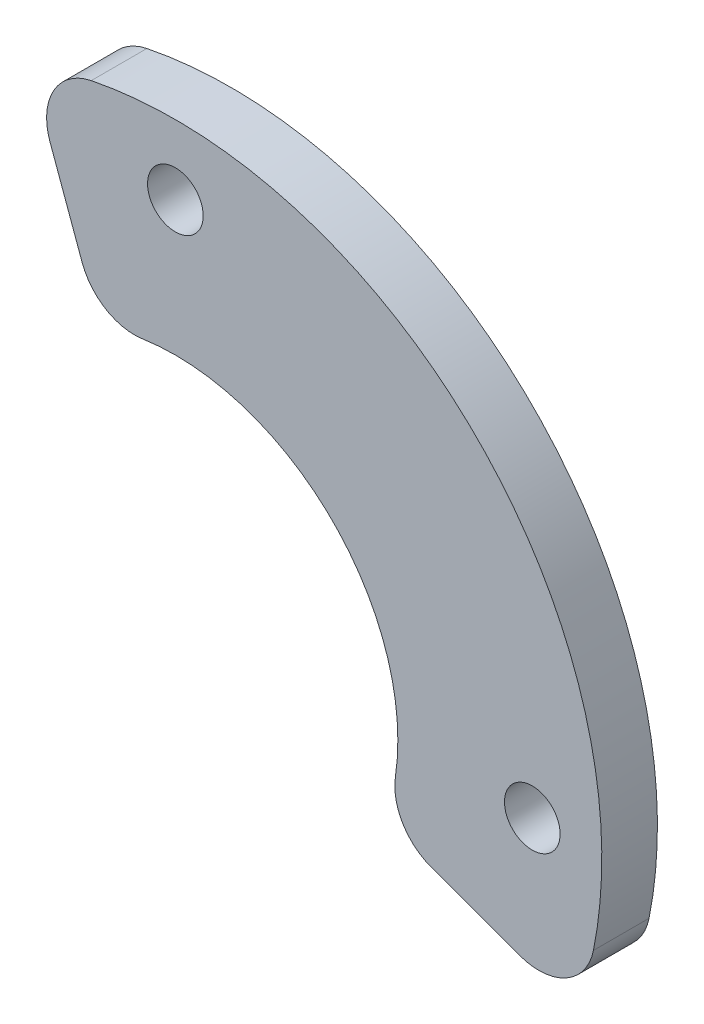
ISO-10303-21;
HEADER;
FILE_DESCRIPTION(('STEP AP214'),'2;1');
FILE_NAME('part.step','',(''),(''),'','','');
FILE_SCHEMA(('AUTOMOTIVE_DESIGN { 1 0 10303 214 1 1 1 1 }'));
ENDSEC;
DATA;
#1=APPLICATION_CONTEXT('core data for automotive mechanical design processes');
#2=APPLICATION_PROTOCOL_DEFINITION('international standard','automotive_design',2000,#1);
#3=PRODUCT_CONTEXT('',#1,'mechanical');
#4=PRODUCT('Part','Part','',(#3));
#5=PRODUCT_RELATED_PRODUCT_CATEGORY('part','',(#4));
#6=PRODUCT_DEFINITION_FORMATION('','',#4);
#7=PRODUCT_DEFINITION_CONTEXT('part definition',#1,'design');
#8=PRODUCT_DEFINITION('design','',#6,#7);
#9=PRODUCT_DEFINITION_SHAPE('','',#8);
#10=(LENGTH_UNIT() NAMED_UNIT(*) SI_UNIT(.MILLI.,.METRE.));
#11=(NAMED_UNIT(*) PLANE_ANGLE_UNIT() SI_UNIT($,.RADIAN.));
#12=(NAMED_UNIT(*) SI_UNIT($,.STERADIAN.) SOLID_ANGLE_UNIT());
#13=UNCERTAINTY_MEASURE_WITH_UNIT(LENGTH_MEASURE(1.E-05),#10,'distance_accuracy_value','');
#14=(GEOMETRIC_REPRESENTATION_CONTEXT(3) GLOBAL_UNCERTAINTY_ASSIGNED_CONTEXT((#13)) GLOBAL_UNIT_ASSIGNED_CONTEXT((#10,
#11,#12)) REPRESENTATION_CONTEXT('',''));
#15=CARTESIAN_POINT('',(0.,0.,0.));
#16=DIRECTION('',(0.,0.,1.));
#17=DIRECTION('',(1.,0.,0.));
#18=AXIS2_PLACEMENT_3D('',#15,#16,#17);
#19=CARTESIAN_POINT('',(0.,0.,3.));
#20=DIRECTION('',(0.342020143325663,0.939692620785911,0.));
#21=DIRECTION('',(-0.939692620785911,0.342020143325663,0.));
#22=AXIS2_PLACEMENT_3D('',#19,#20,#21);
#23=PLANE('',#22);
#24=DIRECTION('',(0.939692620785911,-0.342020143325663,0.));
#25=VECTOR('',#24,1.);
#26=CARTESIAN_POINT('',(0.,0.,0.));
#27=LINE('',#26,#25);
#28=CARTESIAN_POINT('',(13.8106046159048,-5.02664899740866,0.));
#29=VERTEX_POINT('',#28);
#30=CARTESIAN_POINT('',(18.5812187067954,-6.76301052566371,0.));
#31=VERTEX_POINT('',#30);
#32=EDGE_CURVE('E144',#29,#31,#27,.T.);
#33=ORIENTED_EDGE('',*,*,#32,.T.);
#34=DIRECTION('',(0.,0.,-1.));
#35=VECTOR('',#34,1.);
#36=CARTESIAN_POINT('',(18.5812187067954,-6.76301052566371,3.));
#37=LINE('',#36,#35);
#38=CARTESIAN_POINT('',(18.5812187067954,-6.76301052566371,3.));
#39=VERTEX_POINT('',#38);
#40=EDGE_CURVE('E118',#31,#39,#37,.F.);
#41=ORIENTED_EDGE('',*,*,#40,.T.);
#42=DIRECTION('',(0.939692620785911,-0.342020143325663,0.));
#43=VECTOR('',#42,1.);
#44=CARTESIAN_POINT('',(0.,0.,3.));
#45=LINE('',#44,#43);
#46=CARTESIAN_POINT('',(13.8106046159048,-5.02664899740866,3.));
#47=VERTEX_POINT('',#46);
#48=EDGE_CURVE('E210',#47,#39,#45,.T.);
#49=ORIENTED_EDGE('',*,*,#48,.F.);
#50=DIRECTION('',(0.,0.,1.));
#51=VECTOR('',#50,1.);
#52=CARTESIAN_POINT('',(13.8106046159048,-5.02664899740866,0.));
#53=LINE('',#52,#51);
#54=EDGE_CURVE('E124',#47,#29,#53,.F.);
#55=ORIENTED_EDGE('',*,*,#54,.T.);
#56=EDGE_LOOP('',(#33,#41,#49,#55));
#57=FACE_BOUND('',#56,.T.);
#58=ADVANCED_FACE('F45',(#57),#23,.F.);
#59=CARTESIAN_POINT('',(0.,0.,3.));
#60=DIRECTION('',(0.,0.,-1.));
#61=DIRECTION('',(-1.,0.,0.));
#62=AXIS2_PLACEMENT_3D('',#59,#60,#61);
#63=CYLINDRICAL_SURFACE('',#62,23.);
#64=CARTESIAN_POINT('',(0.,0.,3.));
#65=DIRECTION('',(0.,0.,1.));
#66=DIRECTION('',(1.,0.,0.));
#67=AXIS2_PLACEMENT_3D('',#64,#65,#66);
#68=CIRCLE('',#67,23.);
#69=CARTESIAN_POINT('',(22.5483710072882,-4.53552256280188,3.));
#70=VERTEX_POINT('',#69);
#71=CARTESIAN_POINT('',(-4.53552256280189,22.5483710072882,3.));
#72=VERTEX_POINT('',#71);
#73=EDGE_CURVE('E134',#70,#72,#68,.T.);
#74=ORIENTED_EDGE('',*,*,#73,.F.);
#75=DIRECTION('',(0.,0.,-1.));
#76=VECTOR('',#75,1.);
#77=CARTESIAN_POINT('',(22.5483710072882,-4.53552256280188,3.));
#78=LINE('',#77,#76);
#79=CARTESIAN_POINT('',(22.5483710072882,-4.53552256280188,0.));
#80=VERTEX_POINT('',#79);
#81=EDGE_CURVE('E117',#70,#80,#78,.T.);
#82=ORIENTED_EDGE('',*,*,#81,.T.);
#83=CARTESIAN_POINT('',(0.,0.,0.));
#84=DIRECTION('',(0.,0.,1.));
#85=DIRECTION('',(1.,0.,0.));
#86=AXIS2_PLACEMENT_3D('',#83,#84,#85);
#87=CIRCLE('',#86,23.);
#88=CARTESIAN_POINT('',(-4.53552256280189,22.5483710072882,0.));
#89=VERTEX_POINT('',#88);
#90=EDGE_CURVE('E131',#80,#89,#87,.T.);
#91=ORIENTED_EDGE('',*,*,#90,.T.);
#92=DIRECTION('',(0.,0.,-1.));
#93=VECTOR('',#92,1.);
#94=CARTESIAN_POINT('',(-4.53552256280189,22.5483710072882,3.));
#95=LINE('',#94,#93);
#96=EDGE_CURVE('E137',#89,#72,#95,.F.);
#97=ORIENTED_EDGE('',*,*,#96,.T.);
#98=EDGE_LOOP('',(#74,#82,#91,#97));
#99=FACE_BOUND('',#98,.T.);
#100=ADVANCED_FACE('F130',(#99),#63,.T.);
#101=CARTESIAN_POINT('',(0.,0.,3.));
#102=DIRECTION('',(-0.93969262078591,-0.342020143325663,0.));
#103=DIRECTION('',(0.342020143325663,-0.939692620785911,0.));
#104=AXIS2_PLACEMENT_3D('',#101,#102,#103);
#105=PLANE('',#104);
#106=DIRECTION('',(-0.342020143325663,0.939692620785911,0.));
#107=VECTOR('',#106,1.);
#108=CARTESIAN_POINT('',(0.,0.,3.));
#109=LINE('',#108,#107);
#110=CARTESIAN_POINT('',(-5.02664899740867,13.8106046159048,3.));
#111=VERTEX_POINT('',#110);
#112=CARTESIAN_POINT('',(-6.76301052566372,18.5812187067954,3.));
#113=VERTEX_POINT('',#112);
#114=EDGE_CURVE('E194',#111,#113,#109,.T.);
#115=ORIENTED_EDGE('',*,*,#114,.T.);
#116=DIRECTION('',(0.,0.,1.));
#117=VECTOR('',#116,1.);
#118=CARTESIAN_POINT('',(-6.76301052566372,18.5812187067954,0.));
#119=LINE('',#118,#117);
#120=CARTESIAN_POINT('',(-6.76301052566372,18.5812187067954,0.));
#121=VERTEX_POINT('',#120);
#122=EDGE_CURVE('E11',#113,#121,#119,.F.);
#123=ORIENTED_EDGE('',*,*,#122,.T.);
#124=DIRECTION('',(-0.342020143325663,0.939692620785911,0.));
#125=VECTOR('',#124,1.);
#126=CARTESIAN_POINT('',(0.,0.,0.));
#127=LINE('',#126,#125);
#128=CARTESIAN_POINT('',(-5.02664899740867,13.8106046159048,0.));
#129=VERTEX_POINT('',#128);
#130=EDGE_CURVE('E143',#129,#121,#127,.T.);
#131=ORIENTED_EDGE('',*,*,#130,.F.);
#132=DIRECTION('',(0.,0.,-1.));
#133=VECTOR('',#132,1.);
#134=CARTESIAN_POINT('',(-5.02664899740866,13.8106046159048,3.));
#135=LINE('',#134,#133);
#136=EDGE_CURVE('E54',#129,#111,#135,.F.);
#137=ORIENTED_EDGE('',*,*,#136,.T.);
#138=EDGE_LOOP('',(#115,#123,#131,#137));
#139=FACE_BOUND('',#138,.T.);
#140=ADVANCED_FACE('F193',(#139),#105,.T.);
#141=CARTESIAN_POINT('',(19.25,0.,3.));
#142=DIRECTION('',(0.,0.,-1.));
#143=DIRECTION('',(-1.,0.,0.));
#144=AXIS2_PLACEMENT_3D('',#141,#142,#143);
#145=CYLINDRICAL_SURFACE('',#144,1.5);
#146=CARTESIAN_POINT('',(19.25,0.,3.));
#147=DIRECTION('',(0.,0.,1.));
#148=DIRECTION('',(1.,0.,0.));
#149=AXIS2_PLACEMENT_3D('',#146,#147,#148);
#150=CIRCLE('',#149,1.5);
#151=CARTESIAN_POINT('',(20.75,0.,3.));
#152=VERTEX_POINT('',#151);
#153=EDGE_CURVE('E212',#152,#152,#150,.T.);
#154=ORIENTED_EDGE('',*,*,#153,.T.);
#155=EDGE_LOOP('',(#154));
#156=FACE_BOUND('',#155,.T.);
#157=CARTESIAN_POINT('',(19.25,0.,0.));
#158=DIRECTION('',(0.,0.,1.));
#159=DIRECTION('',(1.,0.,0.));
#160=AXIS2_PLACEMENT_3D('',#157,#158,#159);
#161=CIRCLE('',#160,1.5);
#162=CARTESIAN_POINT('',(20.75,0.,0.));
#163=VERTEX_POINT('',#162);
#164=EDGE_CURVE('E150',#163,#163,#161,.T.);
#165=ORIENTED_EDGE('',*,*,#164,.F.);
#166=EDGE_LOOP('',(#165));
#167=FACE_BOUND('',#166,.T.);
#168=ADVANCED_FACE('F231',(#156,#167),#145,.F.);
#169=CARTESIAN_POINT('',(0.,19.25,3.));
#170=DIRECTION('',(0.,0.,-1.));
#171=DIRECTION('',(-1.,0.,0.));
#172=AXIS2_PLACEMENT_3D('',#169,#170,#171);
#173=CYLINDRICAL_SURFACE('',#172,1.5);
#174=CARTESIAN_POINT('',(0.,19.25,3.));
#175=DIRECTION('',(0.,0.,1.));
#176=DIRECTION('',(1.,0.,0.));
#177=AXIS2_PLACEMENT_3D('',#174,#175,#176);
#178=CIRCLE('',#177,1.5);
#179=CARTESIAN_POINT('',(1.5,19.25,3.));
#180=VERTEX_POINT('',#179);
#181=EDGE_CURVE('E157',#180,#180,#178,.T.);
#182=ORIENTED_EDGE('',*,*,#181,.T.);
#183=EDGE_LOOP('',(#182));
#184=FACE_BOUND('',#183,.T.);
#185=CARTESIAN_POINT('',(0.,19.25,0.));
#186=DIRECTION('',(0.,0.,1.));
#187=DIRECTION('',(1.,0.,0.));
#188=AXIS2_PLACEMENT_3D('',#185,#186,#187);
#189=CIRCLE('',#188,1.5);
#190=CARTESIAN_POINT('',(1.5,19.25,0.));
#191=VERTEX_POINT('',#190);
#192=EDGE_CURVE('E223',#191,#191,#189,.T.);
#193=ORIENTED_EDGE('',*,*,#192,.F.);
#194=EDGE_LOOP('',(#193));
#195=FACE_BOUND('',#194,.T.);
#196=ADVANCED_FACE('F233',(#184,#195),#173,.F.);
#197=CARTESIAN_POINT('',(0.,0.,3.));
#198=DIRECTION('',(0.,0.,-1.));
#199=DIRECTION('',(-1.,0.,0.));
#200=AXIS2_PLACEMENT_3D('',#197,#198,#199);
#201=CYLINDRICAL_SURFACE('',#200,12.);
#202=CARTESIAN_POINT('',(0.,0.,0.));
#203=DIRECTION('',(0.,0.,1.));
#204=DIRECTION('',(1.,0.,0.));
#205=AXIS2_PLACEMENT_3D('',#202,#203,#204);
#206=CIRCLE('',#205,12.);
#207=CARTESIAN_POINT('',(11.8693320367054,-1.76605690804074,0.));
#208=VERTEX_POINT('',#207);
#209=CARTESIAN_POINT('',(-1.76605690804075,11.8693320367054,0.));
#210=VERTEX_POINT('',#209);
#211=EDGE_CURVE('E148',#208,#210,#206,.T.);
#212=ORIENTED_EDGE('',*,*,#211,.F.);
#213=DIRECTION('',(0.,0.,-1.));
#214=VECTOR('',#213,1.);
#215=CARTESIAN_POINT('',(11.8693320367054,-1.76605690804074,3.));
#216=LINE('',#215,#214);
#217=CARTESIAN_POINT('',(11.8693320367054,-1.76605690804074,3.));
#218=VERTEX_POINT('',#217);
#219=EDGE_CURVE('E68',#208,#218,#216,.F.);
#220=ORIENTED_EDGE('',*,*,#219,.T.);
#221=CARTESIAN_POINT('',(0.,0.,3.));
#222=DIRECTION('',(0.,0.,1.));
#223=DIRECTION('',(1.,0.,0.));
#224=AXIS2_PLACEMENT_3D('',#221,#222,#223);
#225=CIRCLE('',#224,12.);
#226=CARTESIAN_POINT('',(-1.76605690804075,11.8693320367054,3.));
#227=VERTEX_POINT('',#226);
#228=EDGE_CURVE('E159',#218,#227,#225,.T.);
#229=ORIENTED_EDGE('',*,*,#228,.T.);
#230=DIRECTION('',(0.,0.,-1.));
#231=VECTOR('',#230,1.);
#232=CARTESIAN_POINT('',(-1.76605690804075,11.8693320367054,3.));
#233=LINE('',#232,#231);
#234=EDGE_CURVE('E183',#227,#210,#233,.T.);
#235=ORIENTED_EDGE('',*,*,#234,.T.);
#236=EDGE_LOOP('',(#212,#220,#229,#235));
#237=FACE_BOUND('',#236,.T.);
#238=ADVANCED_FACE('F203',(#237),#201,.F.);
#239=CARTESIAN_POINT('',(0.,0.,3.));
#240=DIRECTION('',(0.,0.,1.));
#241=DIRECTION('',(1.,0.,0.));
#242=AXIS2_PLACEMENT_3D('',#239,#240,#241);
#243=PLANE('',#242);
#244=ORIENTED_EDGE('',*,*,#181,.F.);
#245=EDGE_LOOP('',(#244));
#246=FACE_BOUND('',#245,.T.);
#247=ORIENTED_EDGE('',*,*,#153,.F.);
#248=EDGE_LOOP('',(#247));
#249=FACE_BOUND('',#248,.T.);
#250=ORIENTED_EDGE('',*,*,#48,.T.);
#251=CARTESIAN_POINT('',(19.6072791367723,-3.94393266330598,3.));
#252=DIRECTION('',(0.,0.,1.));
#253=DIRECTION('',(1.,0.,0.));
#254=AXIS2_PLACEMENT_3D('',#251,#252,#253);
#255=CIRCLE('',#254,3.);
#256=EDGE_CURVE('E180',#39,#70,#255,.T.);
#257=ORIENTED_EDGE('',*,*,#256,.T.);
#258=ORIENTED_EDGE('',*,*,#73,.T.);
#259=CARTESIAN_POINT('',(-3.94393266330599,19.6072791367723,3.));
#260=DIRECTION('',(0.,0.,1.));
#261=DIRECTION('',(1.,0.,0.));
#262=AXIS2_PLACEMENT_3D('',#259,#260,#261);
#263=CIRCLE('',#262,3.);
#264=EDGE_CURVE('E174',#72,#113,#263,.T.);
#265=ORIENTED_EDGE('',*,*,#264,.T.);
#266=ORIENTED_EDGE('',*,*,#114,.F.);
#267=CARTESIAN_POINT('',(-2.20757113505093,14.8366650458818,3.));
#268=DIRECTION('',(0.,0.,1.));
#269=DIRECTION('',(1.,0.,0.));
#270=AXIS2_PLACEMENT_3D('',#267,#268,#269);
#271=CIRCLE('',#270,3.);
#272=EDGE_CURVE('E61',#111,#227,#271,.T.);
#273=ORIENTED_EDGE('',*,*,#272,.T.);
#274=ORIENTED_EDGE('',*,*,#228,.F.);
#275=CARTESIAN_POINT('',(14.8366650458818,-2.20757113505093,3.));
#276=DIRECTION('',(0.,0.,1.));
#277=DIRECTION('',(1.,0.,0.));
#278=AXIS2_PLACEMENT_3D('',#275,#276,#277);
#279=CIRCLE('',#278,3.);
#280=EDGE_CURVE('E177',#218,#47,#279,.T.);
#281=ORIENTED_EDGE('',*,*,#280,.T.);
#282=EDGE_LOOP('',(#250,#257,#258,#265,#266,#273,#274,#281));
#283=FACE_BOUND('',#282,.T.);
#284=ADVANCED_FACE('F198',(#246,#249,#283),#243,.T.);
#285=CARTESIAN_POINT('',(0.,0.,0.));
#286=DIRECTION('',(0.,0.,1.));
#287=DIRECTION('',(1.,0.,0.));
#288=AXIS2_PLACEMENT_3D('',#285,#286,#287);
#289=PLANE('',#288);
#290=ORIENTED_EDGE('',*,*,#192,.T.);
#291=EDGE_LOOP('',(#290));
#292=FACE_BOUND('',#291,.T.);
#293=ORIENTED_EDGE('',*,*,#164,.T.);
#294=EDGE_LOOP('',(#293));
#295=FACE_BOUND('',#294,.T.);
#296=ORIENTED_EDGE('',*,*,#90,.F.);
#297=CARTESIAN_POINT('',(19.6072791367723,-3.94393266330598,0.));
#298=DIRECTION('',(0.,0.,1.));
#299=DIRECTION('',(1.,0.,0.));
#300=AXIS2_PLACEMENT_3D('',#297,#298,#299);
#301=CIRCLE('',#300,3.);
#302=EDGE_CURVE('E113',#80,#31,#301,.F.);
#303=ORIENTED_EDGE('',*,*,#302,.T.);
#304=ORIENTED_EDGE('',*,*,#32,.F.);
#305=CARTESIAN_POINT('',(14.8366650458818,-2.20757113505093,0.));
#306=DIRECTION('',(0.,0.,1.));
#307=DIRECTION('',(1.,0.,0.));
#308=AXIS2_PLACEMENT_3D('',#305,#306,#307);
#309=CIRCLE('',#308,3.);
#310=EDGE_CURVE('E125',#29,#208,#309,.F.);
#311=ORIENTED_EDGE('',*,*,#310,.T.);
#312=ORIENTED_EDGE('',*,*,#211,.T.);
#313=CARTESIAN_POINT('',(-2.20757113505093,14.8366650458818,0.));
#314=DIRECTION('',(0.,0.,1.));
#315=DIRECTION('',(1.,0.,0.));
#316=AXIS2_PLACEMENT_3D('',#313,#314,#315);
#317=CIRCLE('',#316,3.);
#318=EDGE_CURVE('E136',#210,#129,#317,.F.);
#319=ORIENTED_EDGE('',*,*,#318,.T.);
#320=ORIENTED_EDGE('',*,*,#130,.T.);
#321=CARTESIAN_POINT('',(-3.94393266330599,19.6072791367723,0.));
#322=DIRECTION('',(0.,0.,1.));
#323=DIRECTION('',(1.,0.,0.));
#324=AXIS2_PLACEMENT_3D('',#321,#322,#323);
#325=CIRCLE('',#324,3.);
#326=EDGE_CURVE('E141',#121,#89,#325,.F.);
#327=ORIENTED_EDGE('',*,*,#326,.T.);
#328=EDGE_LOOP('',(#296,#303,#304,#311,#312,#319,#320,#327));
#329=FACE_BOUND('',#328,.T.);
#330=ADVANCED_FACE('F139',(#292,#295,#329),#289,.F.);
#331=CARTESIAN_POINT('',(19.6072791367723,-3.94393266330598,3.));
#332=DIRECTION('',(0.,0.,-1.));
#333=DIRECTION('',(-1.,0.,0.));
#334=AXIS2_PLACEMENT_3D('',#331,#332,#333);
#335=CYLINDRICAL_SURFACE('',#334,3.);
#336=ORIENTED_EDGE('',*,*,#256,.F.);
#337=ORIENTED_EDGE('',*,*,#40,.F.);
#338=ORIENTED_EDGE('',*,*,#302,.F.);
#339=ORIENTED_EDGE('',*,*,#81,.F.);
#340=EDGE_LOOP('',(#336,#337,#338,#339));
#341=FACE_BOUND('',#340,.T.);
#342=ADVANCED_FACE('F116',(#341),#335,.T.);
#343=CARTESIAN_POINT('',(14.8366650458818,-2.20757113505093,3.));
#344=DIRECTION('',(0.,0.,-1.));
#345=DIRECTION('',(-1.,0.,0.));
#346=AXIS2_PLACEMENT_3D('',#343,#344,#345);
#347=CYLINDRICAL_SURFACE('',#346,3.);
#348=ORIENTED_EDGE('',*,*,#280,.F.);
#349=ORIENTED_EDGE('',*,*,#219,.F.);
#350=ORIENTED_EDGE('',*,*,#310,.F.);
#351=ORIENTED_EDGE('',*,*,#54,.F.);
#352=EDGE_LOOP('',(#348,#349,#350,#351));
#353=FACE_BOUND('',#352,.T.);
#354=ADVANCED_FACE('F207',(#353),#347,.T.);
#355=CARTESIAN_POINT('',(-3.94393266330599,19.6072791367723,3.));
#356=DIRECTION('',(0.,0.,-1.));
#357=DIRECTION('',(-1.,0.,0.));
#358=AXIS2_PLACEMENT_3D('',#355,#356,#357);
#359=CYLINDRICAL_SURFACE('',#358,3.);
#360=ORIENTED_EDGE('',*,*,#264,.F.);
#361=ORIENTED_EDGE('',*,*,#96,.F.);
#362=ORIENTED_EDGE('',*,*,#326,.F.);
#363=ORIENTED_EDGE('',*,*,#122,.F.);
#364=EDGE_LOOP('',(#360,#361,#362,#363));
#365=FACE_BOUND('',#364,.T.);
#366=ADVANCED_FACE('F284',(#365),#359,.T.);
#367=CARTESIAN_POINT('',(-2.20757113505093,14.8366650458818,3.));
#368=DIRECTION('',(0.,0.,-1.));
#369=DIRECTION('',(-1.,0.,0.));
#370=AXIS2_PLACEMENT_3D('',#367,#368,#369);
#371=CYLINDRICAL_SURFACE('',#370,3.);
#372=ORIENTED_EDGE('',*,*,#272,.F.);
#373=ORIENTED_EDGE('',*,*,#136,.F.);
#374=ORIENTED_EDGE('',*,*,#318,.F.);
#375=ORIENTED_EDGE('',*,*,#234,.F.);
#376=EDGE_LOOP('',(#372,#373,#374,#375));
#377=FACE_BOUND('',#376,.T.);
#378=ADVANCED_FACE('F47',(#377),#371,.T.);
#379=CLOSED_SHELL('',(#58,#100,#140,#168,#196,#238,#284,#330,#342,#354,#366,#378));
#380=MANIFOLD_SOLID_BREP('B2',#379);
#381=ADVANCED_BREP_SHAPE_REPRESENTATION('',(#18,#380),#14);
#382=SHAPE_DEFINITION_REPRESENTATION(#9,#381);
ENDSEC;
END-ISO-10303-21;
